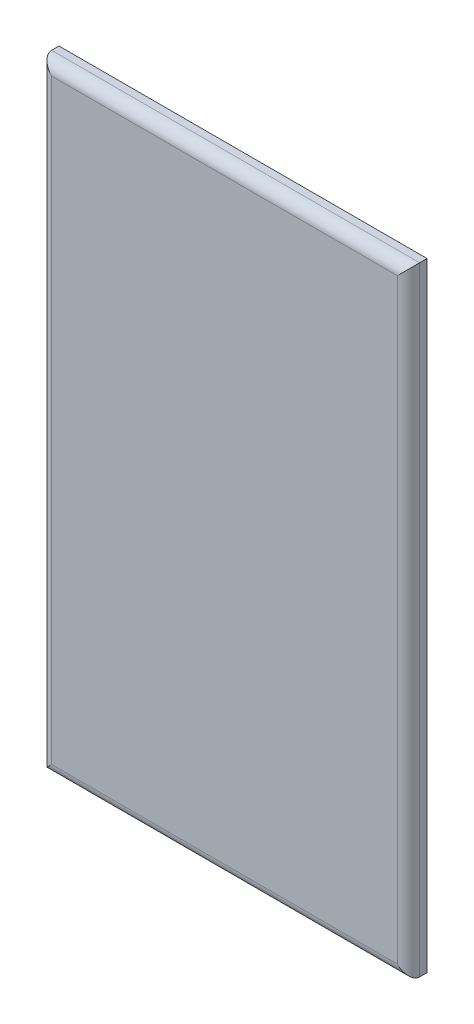
ISO-10303-21;
HEADER;
FILE_DESCRIPTION(('STEP AP214'),'2;1');
FILE_NAME('part.step','',(''),(''),'','','');
FILE_SCHEMA(('AUTOMOTIVE_DESIGN { 1 0 10303 214 1 1 1 1 }'));
ENDSEC;
DATA;
#1=APPLICATION_CONTEXT('core data for automotive mechanical design processes');
#2=APPLICATION_PROTOCOL_DEFINITION('international standard','automotive_design',2000,#1);
#3=PRODUCT_CONTEXT('',#1,'mechanical');
#4=PRODUCT('Part','Part','',(#3));
#5=PRODUCT_RELATED_PRODUCT_CATEGORY('part','',(#4));
#6=PRODUCT_DEFINITION_FORMATION('','',#4);
#7=PRODUCT_DEFINITION_CONTEXT('part definition',#1,'design');
#8=PRODUCT_DEFINITION('design','',#6,#7);
#9=PRODUCT_DEFINITION_SHAPE('','',#8);
#10=(LENGTH_UNIT() NAMED_UNIT(*) SI_UNIT(.MILLI.,.METRE.));
#11=(NAMED_UNIT(*) PLANE_ANGLE_UNIT() SI_UNIT($,.RADIAN.));
#12=(NAMED_UNIT(*) SI_UNIT($,.STERADIAN.) SOLID_ANGLE_UNIT());
#13=UNCERTAINTY_MEASURE_WITH_UNIT(LENGTH_MEASURE(1.E-05),#10,'distance_accuracy_value','');
#14=(GEOMETRIC_REPRESENTATION_CONTEXT(3) GLOBAL_UNCERTAINTY_ASSIGNED_CONTEXT((#13)) GLOBAL_UNIT_ASSIGNED_CONTEXT((#10,
#11,#12)) REPRESENTATION_CONTEXT('',''));
#15=CARTESIAN_POINT('',(0.,0.,0.));
#16=DIRECTION('',(0.,0.,1.));
#17=DIRECTION('',(1.,0.,0.));
#18=AXIS2_PLACEMENT_3D('',#15,#16,#17);
#19=CARTESIAN_POINT('',(-44.0525358152407,94.6577628041884,5.));
#20=DIRECTION('',(1.,0.,0.));
#21=DIRECTION('',(0.,1.,0.));
#22=AXIS2_PLACEMENT_3D('',#19,#20,#21);
#23=PLANE('',#22);
#24=DIRECTION('',(0.,0.,-1.));
#25=VECTOR('',#24,1.);
#26=CARTESIAN_POINT('',(-44.0525358152407,-71.8622371958116,5.));
#27=LINE('',#26,#25);
#28=CARTESIAN_POINT('',(-44.0525358152407,-71.8622371958116,2.));
#29=VERTEX_POINT('',#28);
#30=CARTESIAN_POINT('',(-44.0525358152407,-71.8622371958116,0.));
#31=VERTEX_POINT('',#30);
#32=EDGE_CURVE('E86',#29,#31,#27,.T.);
#33=ORIENTED_EDGE('',*,*,#32,.F.);
#34=DIRECTION('',(0.,-1.,0.));
#35=VECTOR('',#34,1.);
#36=CARTESIAN_POINT('',(-44.0525358152407,94.6577628041884,2.));
#37=LINE('',#36,#35);
#38=CARTESIAN_POINT('',(-44.0525358152407,94.6577628041884,2.));
#39=VERTEX_POINT('',#38);
#40=EDGE_CURVE('E11',#29,#39,#37,.F.);
#41=ORIENTED_EDGE('',*,*,#40,.T.);
#42=DIRECTION('',(0.,0.,-1.));
#43=VECTOR('',#42,1.);
#44=CARTESIAN_POINT('',(-44.0525358152407,94.6577628041884,5.));
#45=LINE('',#44,#43);
#46=CARTESIAN_POINT('',(-44.0525358152407,94.6577628041884,0.));
#47=VERTEX_POINT('',#46);
#48=EDGE_CURVE('E106',#39,#47,#45,.T.);
#49=ORIENTED_EDGE('',*,*,#48,.T.);
#50=DIRECTION('',(0.,-1.,0.));
#51=VECTOR('',#50,1.);
#52=CARTESIAN_POINT('',(-44.0525358152407,94.6577628041884,0.));
#53=LINE('',#52,#51);
#54=EDGE_CURVE('E102',#47,#31,#53,.T.);
#55=ORIENTED_EDGE('',*,*,#54,.T.);
#56=EDGE_LOOP('',(#33,#41,#49,#55));
#57=FACE_BOUND('',#56,.T.);
#58=ADVANCED_FACE('F33',(#57),#23,.F.);
#59=CARTESIAN_POINT('',(-44.0525358152407,-71.8622371958116,5.));
#60=DIRECTION('',(0.,1.,0.));
#61=DIRECTION('',(0.,0.,1.));
#62=AXIS2_PLACEMENT_3D('',#59,#60,#61);
#63=PLANE('',#62);
#64=DIRECTION('',(0.,0.,-1.));
#65=VECTOR('',#64,1.);
#66=CARTESIAN_POINT('',(55.0474641847593,-71.8622371958116,5.));
#67=LINE('',#66,#65);
#68=CARTESIAN_POINT('',(55.0474641847593,-71.8622371958116,2.));
#69=VERTEX_POINT('',#68);
#70=CARTESIAN_POINT('',(55.0474641847593,-71.8622371958116,0.));
#71=VERTEX_POINT('',#70);
#72=EDGE_CURVE('E96',#69,#71,#67,.T.);
#73=ORIENTED_EDGE('',*,*,#72,.F.);
#74=DIRECTION('',(1.,0.,0.));
#75=VECTOR('',#74,1.);
#76=CARTESIAN_POINT('',(-44.0525358152407,-71.8622371958116,2.));
#77=LINE('',#76,#75);
#78=EDGE_CURVE('E93',#69,#29,#77,.F.);
#79=ORIENTED_EDGE('',*,*,#78,.T.);
#80=ORIENTED_EDGE('',*,*,#32,.T.);
#81=DIRECTION('',(1.,0.,0.));
#82=VECTOR('',#81,1.);
#83=CARTESIAN_POINT('',(-44.0525358152407,-71.8622371958116,0.));
#84=LINE('',#83,#82);
#85=EDGE_CURVE('E90',#31,#71,#84,.T.);
#86=ORIENTED_EDGE('',*,*,#85,.T.);
#87=EDGE_LOOP('',(#73,#79,#80,#86));
#88=FACE_BOUND('',#87,.T.);
#89=ADVANCED_FACE('F89',(#88),#63,.F.);
#90=CARTESIAN_POINT('',(55.0474641847593,94.6577628041884,5.));
#91=DIRECTION('',(-1.,0.,0.));
#92=DIRECTION('',(0.,-1.,0.));
#93=AXIS2_PLACEMENT_3D('',#90,#91,#92);
#94=PLANE('',#93);
#95=DIRECTION('',(0.,0.,-1.));
#96=VECTOR('',#95,1.);
#97=CARTESIAN_POINT('',(55.0474641847593,94.6577628041884,5.));
#98=LINE('',#97,#96);
#99=CARTESIAN_POINT('',(55.0474641847593,94.6577628041884,2.));
#100=VERTEX_POINT('',#99);
#101=CARTESIAN_POINT('',(55.0474641847593,94.6577628041884,0.));
#102=VERTEX_POINT('',#101);
#103=EDGE_CURVE('E119',#100,#102,#98,.T.);
#104=ORIENTED_EDGE('',*,*,#103,.F.);
#105=DIRECTION('',(0.,1.,0.));
#106=VECTOR('',#105,1.);
#107=CARTESIAN_POINT('',(55.0474641847593,-71.8622371958116,2.));
#108=LINE('',#107,#106);
#109=EDGE_CURVE('E131',#100,#69,#108,.F.);
#110=ORIENTED_EDGE('',*,*,#109,.T.);
#111=ORIENTED_EDGE('',*,*,#72,.T.);
#112=DIRECTION('',(0.,1.,0.));
#113=VECTOR('',#112,1.);
#114=CARTESIAN_POINT('',(55.0474641847593,94.6577628041884,0.));
#115=LINE('',#114,#113);
#116=EDGE_CURVE('E104',#71,#102,#115,.T.);
#117=ORIENTED_EDGE('',*,*,#116,.T.);
#118=EDGE_LOOP('',(#104,#110,#111,#117));
#119=FACE_BOUND('',#118,.T.);
#120=ADVANCED_FACE('F168',(#119),#94,.F.);
#121=CARTESIAN_POINT('',(-44.0525358152407,94.6577628041884,5.));
#122=DIRECTION('',(0.,-1.,0.));
#123=DIRECTION('',(0.,0.,-1.));
#124=AXIS2_PLACEMENT_3D('',#121,#122,#123);
#125=PLANE('',#124);
#126=ORIENTED_EDGE('',*,*,#48,.F.);
#127=DIRECTION('',(-1.,0.,0.));
#128=VECTOR('',#127,1.);
#129=CARTESIAN_POINT('',(55.0474641847593,94.6577628041884,2.));
#130=LINE('',#129,#128);
#131=EDGE_CURVE('E42',#39,#100,#130,.F.);
#132=ORIENTED_EDGE('',*,*,#131,.T.);
#133=ORIENTED_EDGE('',*,*,#103,.T.);
#134=DIRECTION('',(-1.,0.,0.));
#135=VECTOR('',#134,1.);
#136=CARTESIAN_POINT('',(-44.0525358152407,94.6577628041884,0.));
#137=LINE('',#136,#135);
#138=EDGE_CURVE('E116',#102,#47,#137,.T.);
#139=ORIENTED_EDGE('',*,*,#138,.T.);
#140=EDGE_LOOP('',(#126,#132,#133,#139));
#141=FACE_BOUND('',#140,.T.);
#142=ADVANCED_FACE('F192',(#141),#125,.F.);
#143=CARTESIAN_POINT('',(0.,0.,5.));
#144=DIRECTION('',(0.,0.,1.));
#145=DIRECTION('',(1.,0.,0.));
#146=AXIS2_PLACEMENT_3D('',#143,#144,#145);
#147=PLANE('',#146);
#148=DIRECTION('',(0.,-1.,0.));
#149=VECTOR('',#148,1.);
#150=CARTESIAN_POINT('',(-41.0525358152407,-71.8622371958116,5.));
#151=LINE('',#150,#149);
#152=CARTESIAN_POINT('',(-41.0525358152407,91.6577628041884,5.));
#153=VERTEX_POINT('',#152);
#154=CARTESIAN_POINT('',(-41.0525358152407,-68.8622371958116,5.));
#155=VERTEX_POINT('',#154);
#156=EDGE_CURVE('E95',#153,#155,#151,.T.);
#157=ORIENTED_EDGE('',*,*,#156,.T.);
#158=DIRECTION('',(1.,0.,0.));
#159=VECTOR('',#158,1.);
#160=CARTESIAN_POINT('',(55.0474641847593,-68.8622371958116,5.));
#161=LINE('',#160,#159);
#162=CARTESIAN_POINT('',(52.0474641847593,-68.8622371958116,5.));
#163=VERTEX_POINT('',#162);
#164=EDGE_CURVE('E127',#155,#163,#161,.T.);
#165=ORIENTED_EDGE('',*,*,#164,.T.);
#166=DIRECTION('',(0.,1.,0.));
#167=VECTOR('',#166,1.);
#168=CARTESIAN_POINT('',(52.0474641847593,94.6577628041884,5.));
#169=LINE('',#168,#167);
#170=CARTESIAN_POINT('',(52.0474641847593,91.6577628041884,5.));
#171=VERTEX_POINT('',#170);
#172=EDGE_CURVE('E125',#163,#171,#169,.T.);
#173=ORIENTED_EDGE('',*,*,#172,.T.);
#174=DIRECTION('',(-1.,0.,0.));
#175=VECTOR('',#174,1.);
#176=CARTESIAN_POINT('',(-44.0525358152407,91.6577628041884,5.));
#177=LINE('',#176,#175);
#178=EDGE_CURVE('E123',#171,#153,#177,.T.);
#179=ORIENTED_EDGE('',*,*,#178,.T.);
#180=EDGE_LOOP('',(#157,#165,#173,#179));
#181=FACE_BOUND('',#180,.T.);
#182=ADVANCED_FACE('F150',(#181),#147,.T.);
#183=CARTESIAN_POINT('',(0.,0.,0.));
#184=DIRECTION('',(0.,0.,1.));
#185=DIRECTION('',(1.,0.,0.));
#186=AXIS2_PLACEMENT_3D('',#183,#184,#185);
#187=PLANE('',#186);
#188=CARTESIAN_POINT('',(-40.5025358152407,-68.3122371958116,0.));
#189=DIRECTION('',(0.,0.,-1.));
#190=DIRECTION('',(-1.,0.,0.));
#191=AXIS2_PLACEMENT_3D('',#188,#189,#190);
#192=CIRCLE('',#191,3.1);
#193=CARTESIAN_POINT('',(-43.6025358152407,-68.3122371958116,0.));
#194=VERTEX_POINT('',#193);
#195=EDGE_CURVE('E309',#194,#194,#192,.T.);
#196=ORIENTED_EDGE('',*,*,#195,.F.);
#197=EDGE_LOOP('',(#196));
#198=FACE_BOUND('',#197,.T.);
#199=CARTESIAN_POINT('',(51.4974641847593,-68.3122371958116,0.));
#200=DIRECTION('',(0.,0.,-1.));
#201=DIRECTION('',(-1.,0.,0.));
#202=AXIS2_PLACEMENT_3D('',#199,#200,#201);
#203=CIRCLE('',#202,3.1);
#204=CARTESIAN_POINT('',(48.3974641847593,-68.3122371958116,0.));
#205=VERTEX_POINT('',#204);
#206=EDGE_CURVE('E308',#205,#205,#203,.T.);
#207=ORIENTED_EDGE('',*,*,#206,.F.);
#208=EDGE_LOOP('',(#207));
#209=FACE_BOUND('',#208,.T.);
#210=CARTESIAN_POINT('',(-40.5025358152407,91.1077628041884,0.));
#211=DIRECTION('',(0.,0.,-1.));
#212=DIRECTION('',(-1.,0.,0.));
#213=AXIS2_PLACEMENT_3D('',#210,#211,#212);
#214=CIRCLE('',#213,3.1);
#215=CARTESIAN_POINT('',(-43.6025358152407,91.1077628041884,0.));
#216=VERTEX_POINT('',#215);
#217=EDGE_CURVE('E318',#216,#216,#214,.T.);
#218=ORIENTED_EDGE('',*,*,#217,.F.);
#219=EDGE_LOOP('',(#218));
#220=FACE_BOUND('',#219,.T.);
#221=CARTESIAN_POINT('',(51.4974641847593,91.1077628041884,0.));
#222=DIRECTION('',(0.,0.,-1.));
#223=DIRECTION('',(-1.,0.,0.));
#224=AXIS2_PLACEMENT_3D('',#221,#222,#223);
#225=CIRCLE('',#224,3.1);
#226=CARTESIAN_POINT('',(48.3974641847593,91.1077628041884,0.));
#227=VERTEX_POINT('',#226);
#228=EDGE_CURVE('E112',#227,#227,#225,.T.);
#229=ORIENTED_EDGE('',*,*,#228,.F.);
#230=EDGE_LOOP('',(#229));
#231=FACE_BOUND('',#230,.T.);
#232=ORIENTED_EDGE('',*,*,#54,.F.);
#233=ORIENTED_EDGE('',*,*,#138,.F.);
#234=ORIENTED_EDGE('',*,*,#116,.F.);
#235=ORIENTED_EDGE('',*,*,#85,.F.);
#236=EDGE_LOOP('',(#232,#233,#234,#235));
#237=FACE_BOUND('',#236,.T.);
#238=ADVANCED_FACE('F100',(#198,#209,#220,#231,#237),#187,.F.);
#239=CARTESIAN_POINT('',(0.,91.6577628041884,2.));
#240=DIRECTION('',(1.,0.,0.));
#241=DIRECTION('',(0.,0.,-1.));
#242=AXIS2_PLACEMENT_3D('',#239,#240,#241);
#243=CYLINDRICAL_SURFACE('',#242,3.);
#244=CARTESIAN_POINT('',(52.0474641847593,91.6577628041884,2.));
#245=DIRECTION('',(0.707106781186547,-0.707106781186547,0.));
#246=DIRECTION('',(0.707106781186547,0.707106781186547,0.));
#247=AXIS2_PLACEMENT_3D('',#244,#245,#246);
#248=ELLIPSE('',#247,4.24264068711928,3.);
#249=EDGE_CURVE('E110',#100,#171,#248,.T.);
#250=ORIENTED_EDGE('',*,*,#249,.F.);
#251=ORIENTED_EDGE('',*,*,#131,.F.);
#252=CARTESIAN_POINT('',(-41.0525358152407,91.6577628041884,2.));
#253=DIRECTION('',(0.707106781186547,0.707106781186548,0.));
#254=DIRECTION('',(-0.707106781186548,0.707106781186547,0.));
#255=AXIS2_PLACEMENT_3D('',#252,#253,#254);
#256=ELLIPSE('',#255,4.24264068711929,3.);
#257=EDGE_CURVE('E37',#153,#39,#256,.F.);
#258=ORIENTED_EDGE('',*,*,#257,.F.);
#259=ORIENTED_EDGE('',*,*,#178,.F.);
#260=EDGE_LOOP('',(#250,#251,#258,#259));
#261=FACE_BOUND('',#260,.T.);
#262=ADVANCED_FACE('F35',(#261),#243,.T.);
#263=CARTESIAN_POINT('',(-41.0525358152407,0.,2.));
#264=DIRECTION('',(0.,1.,0.));
#265=DIRECTION('',(-1.,0.,0.));
#266=AXIS2_PLACEMENT_3D('',#263,#264,#265);
#267=CYLINDRICAL_SURFACE('',#266,3.);
#268=ORIENTED_EDGE('',*,*,#257,.T.);
#269=ORIENTED_EDGE('',*,*,#40,.F.);
#270=CARTESIAN_POINT('',(-41.0525358152407,-68.8622371958116,2.));
#271=DIRECTION('',(-0.707106781186548,0.707106781186547,0.));
#272=DIRECTION('',(0.707106781186547,0.707106781186548,0.));
#273=AXIS2_PLACEMENT_3D('',#270,#271,#272);
#274=ELLIPSE('',#273,4.24264068711928,3.);
#275=EDGE_CURVE('E136',#155,#29,#274,.F.);
#276=ORIENTED_EDGE('',*,*,#275,.F.);
#277=ORIENTED_EDGE('',*,*,#156,.F.);
#278=EDGE_LOOP('',(#268,#269,#276,#277));
#279=FACE_BOUND('',#278,.T.);
#280=ADVANCED_FACE('F156',(#279),#267,.T.);
#281=CARTESIAN_POINT('',(52.0474641847593,0.,2.));
#282=DIRECTION('',(0.,-1.,0.));
#283=DIRECTION('',(1.,0.,0.));
#284=AXIS2_PLACEMENT_3D('',#281,#282,#283);
#285=CYLINDRICAL_SURFACE('',#284,3.);
#286=ORIENTED_EDGE('',*,*,#249,.T.);
#287=ORIENTED_EDGE('',*,*,#172,.F.);
#288=CARTESIAN_POINT('',(52.0474641847593,-68.8622371958116,2.));
#289=DIRECTION('',(-0.707106781186547,-0.707106781186547,0.));
#290=DIRECTION('',(0.707106781186547,-0.707106781186547,0.));
#291=AXIS2_PLACEMENT_3D('',#288,#289,#290);
#292=ELLIPSE('',#291,4.24264068711928,3.);
#293=EDGE_CURVE('E134',#69,#163,#292,.T.);
#294=ORIENTED_EDGE('',*,*,#293,.F.);
#295=ORIENTED_EDGE('',*,*,#109,.F.);
#296=EDGE_LOOP('',(#286,#287,#294,#295));
#297=FACE_BOUND('',#296,.T.);
#298=ADVANCED_FACE('F143',(#297),#285,.T.);
#299=CARTESIAN_POINT('',(0.,-68.8622371958116,2.));
#300=DIRECTION('',(-1.,0.,0.));
#301=DIRECTION('',(0.,0.,1.));
#302=AXIS2_PLACEMENT_3D('',#299,#300,#301);
#303=CYLINDRICAL_SURFACE('',#302,3.);
#304=ORIENTED_EDGE('',*,*,#275,.T.);
#305=ORIENTED_EDGE('',*,*,#78,.F.);
#306=ORIENTED_EDGE('',*,*,#293,.T.);
#307=ORIENTED_EDGE('',*,*,#164,.F.);
#308=EDGE_LOOP('',(#304,#305,#306,#307));
#309=FACE_BOUND('',#308,.T.);
#310=ADVANCED_FACE('F154',(#309),#303,.T.);
#311=CARTESIAN_POINT('',(51.4974641847593,91.1077628041884,1.6));
#312=DIRECTION('',(0.,0.,-1.));
#313=DIRECTION('',(-1.,0.,0.));
#314=AXIS2_PLACEMENT_3D('',#311,#312,#313);
#315=CYLINDRICAL_SURFACE('',#314,3.1);
#316=CARTESIAN_POINT('',(51.4974641847593,91.1077628041884,1.6));
#317=DIRECTION('',(0.,0.,-1.));
#318=DIRECTION('',(-1.,0.,0.));
#319=AXIS2_PLACEMENT_3D('',#316,#317,#318);
#320=CIRCLE('',#319,3.1);
#321=CARTESIAN_POINT('',(48.3974641847593,91.1077628041884,1.6));
#322=VERTEX_POINT('',#321);
#323=EDGE_CURVE('E137',#322,#322,#320,.T.);
#324=ORIENTED_EDGE('',*,*,#323,.F.);
#325=EDGE_LOOP('',(#324));
#326=FACE_BOUND('',#325,.T.);
#327=ORIENTED_EDGE('',*,*,#228,.T.);
#328=EDGE_LOOP('',(#327));
#329=FACE_BOUND('',#328,.T.);
#330=ADVANCED_FACE('F173',(#326,#329),#315,.F.);
#331=CARTESIAN_POINT('',(51.4974641847593,91.1077628041884,1.6));
#332=DIRECTION('',(0.,0.,-1.));
#333=DIRECTION('',(-1.,0.,0.));
#334=AXIS2_PLACEMENT_3D('',#331,#332,#333);
#335=PLANE('',#334);
#336=ORIENTED_EDGE('',*,*,#323,.T.);
#337=EDGE_LOOP('',(#336));
#338=FACE_BOUND('',#337,.T.);
#339=ADVANCED_FACE('F177',(#338),#335,.T.);
#340=CARTESIAN_POINT('',(-40.5025358152407,91.1077628041884,1.6));
#341=DIRECTION('',(0.,0.,-1.));
#342=DIRECTION('',(-1.,0.,0.));
#343=AXIS2_PLACEMENT_3D('',#340,#341,#342);
#344=CYLINDRICAL_SURFACE('',#343,3.1);
#345=CARTESIAN_POINT('',(-40.5025358152407,91.1077628041884,1.6));
#346=DIRECTION('',(0.,0.,-1.));
#347=DIRECTION('',(-1.,0.,0.));
#348=AXIS2_PLACEMENT_3D('',#345,#346,#347);
#349=CIRCLE('',#348,3.1);
#350=CARTESIAN_POINT('',(-43.6025358152407,91.1077628041884,1.6));
#351=VERTEX_POINT('',#350);
#352=EDGE_CURVE('E320',#351,#351,#349,.T.);
#353=ORIENTED_EDGE('',*,*,#352,.F.);
#354=EDGE_LOOP('',(#353));
#355=FACE_BOUND('',#354,.T.);
#356=ORIENTED_EDGE('',*,*,#217,.T.);
#357=EDGE_LOOP('',(#356));
#358=FACE_BOUND('',#357,.T.);
#359=ADVANCED_FACE('F183',(#355,#358),#344,.F.);
#360=CARTESIAN_POINT('',(-40.5025358152407,91.1077628041884,1.6));
#361=DIRECTION('',(0.,0.,-1.));
#362=DIRECTION('',(-1.,0.,0.));
#363=AXIS2_PLACEMENT_3D('',#360,#361,#362);
#364=PLANE('',#363);
#365=ORIENTED_EDGE('',*,*,#352,.T.);
#366=EDGE_LOOP('',(#365));
#367=FACE_BOUND('',#366,.T.);
#368=ADVANCED_FACE('F254',(#367),#364,.T.);
#369=CARTESIAN_POINT('',(51.4974641847593,-68.3122371958116,1.6));
#370=DIRECTION('',(0.,0.,-1.));
#371=DIRECTION('',(-1.,0.,0.));
#372=AXIS2_PLACEMENT_3D('',#369,#370,#371);
#373=CYLINDRICAL_SURFACE('',#372,3.1);
#374=CARTESIAN_POINT('',(51.4974641847593,-68.3122371958116,1.6));
#375=DIRECTION('',(0.,0.,-1.));
#376=DIRECTION('',(-1.,0.,0.));
#377=AXIS2_PLACEMENT_3D('',#374,#375,#376);
#378=CIRCLE('',#377,3.1);
#379=CARTESIAN_POINT('',(48.3974641847593,-68.3122371958116,1.6));
#380=VERTEX_POINT('',#379);
#381=EDGE_CURVE('E312',#380,#380,#378,.T.);
#382=ORIENTED_EDGE('',*,*,#381,.F.);
#383=EDGE_LOOP('',(#382));
#384=FACE_BOUND('',#383,.T.);
#385=ORIENTED_EDGE('',*,*,#206,.T.);
#386=EDGE_LOOP('',(#385));
#387=FACE_BOUND('',#386,.T.);
#388=ADVANCED_FACE('F263',(#384,#387),#373,.F.);
#389=CARTESIAN_POINT('',(51.4974641847593,-68.3122371958116,1.6));
#390=DIRECTION('',(0.,0.,-1.));
#391=DIRECTION('',(-1.,0.,0.));
#392=AXIS2_PLACEMENT_3D('',#389,#390,#391);
#393=PLANE('',#392);
#394=ORIENTED_EDGE('',*,*,#381,.T.);
#395=EDGE_LOOP('',(#394));
#396=FACE_BOUND('',#395,.T.);
#397=ADVANCED_FACE('F272',(#396),#393,.T.);
#398=CARTESIAN_POINT('',(-40.5025358152407,-68.3122371958116,1.6));
#399=DIRECTION('',(0.,0.,-1.));
#400=DIRECTION('',(-1.,0.,0.));
#401=AXIS2_PLACEMENT_3D('',#398,#399,#400);
#402=CYLINDRICAL_SURFACE('',#401,3.1);
#403=CARTESIAN_POINT('',(-40.5025358152407,-68.3122371958116,1.6));
#404=DIRECTION('',(0.,0.,-1.));
#405=DIRECTION('',(-1.,0.,0.));
#406=AXIS2_PLACEMENT_3D('',#403,#404,#405);
#407=CIRCLE('',#406,3.1);
#408=CARTESIAN_POINT('',(-43.6025358152407,-68.3122371958116,1.6));
#409=VERTEX_POINT('',#408);
#410=EDGE_CURVE('E307',#409,#409,#407,.T.);
#411=ORIENTED_EDGE('',*,*,#410,.F.);
#412=EDGE_LOOP('',(#411));
#413=FACE_BOUND('',#412,.T.);
#414=ORIENTED_EDGE('',*,*,#195,.T.);
#415=EDGE_LOOP('',(#414));
#416=FACE_BOUND('',#415,.T.);
#417=ADVANCED_FACE('F281',(#413,#416),#402,.F.);
#418=CARTESIAN_POINT('',(-40.5025358152407,-68.3122371958116,1.6));
#419=DIRECTION('',(0.,0.,-1.));
#420=DIRECTION('',(-1.,0.,0.));
#421=AXIS2_PLACEMENT_3D('',#418,#419,#420);
#422=PLANE('',#421);
#423=ORIENTED_EDGE('',*,*,#410,.T.);
#424=EDGE_LOOP('',(#423));
#425=FACE_BOUND('',#424,.T.);
#426=ADVANCED_FACE('F291',(#425),#422,.T.);
#427=CLOSED_SHELL('',(#58,#89,#120,#142,#182,#238,#262,#280,#298,#310,#330,#339,#359,#368,#388,
#397,#417,#426));
#428=MANIFOLD_SOLID_BREP('B2',#427);
#429=ADVANCED_BREP_SHAPE_REPRESENTATION('',(#18,#428),#14);
#430=SHAPE_DEFINITION_REPRESENTATION(#9,#429);
ENDSEC;
END-ISO-10303-21;
